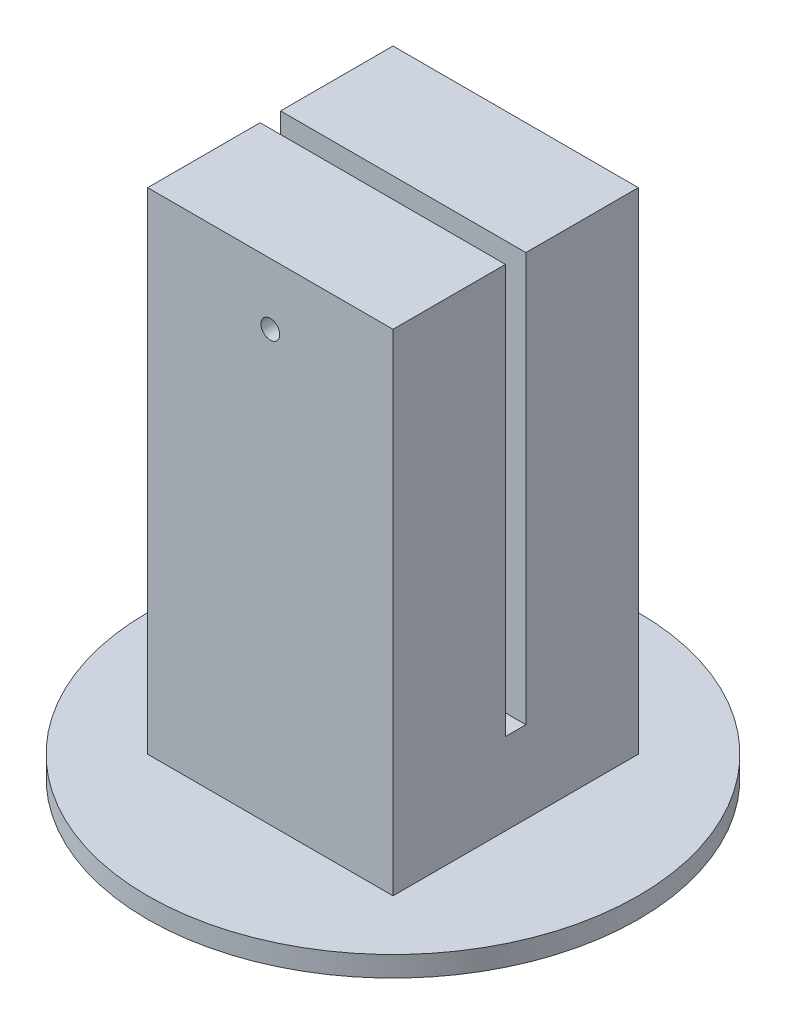
ISO-10303-21;
HEADER;
FILE_DESCRIPTION(('STEP AP214'),'2;1');
FILE_NAME('part.step','',(''),(''),'','','');
FILE_SCHEMA(('AUTOMOTIVE_DESIGN { 1 0 10303 214 1 1 1 1 }'));
ENDSEC;
DATA;
#1=APPLICATION_CONTEXT('core data for automotive mechanical design processes');
#2=APPLICATION_PROTOCOL_DEFINITION('international standard','automotive_design',2000,#1);
#3=PRODUCT_CONTEXT('',#1,'mechanical');
#4=PRODUCT('Part','Part','',(#3));
#5=PRODUCT_RELATED_PRODUCT_CATEGORY('part','',(#4));
#6=PRODUCT_DEFINITION_FORMATION('','',#4);
#7=PRODUCT_DEFINITION_CONTEXT('part definition',#1,'design');
#8=PRODUCT_DEFINITION('design','',#6,#7);
#9=PRODUCT_DEFINITION_SHAPE('','',#8);
#10=(LENGTH_UNIT() NAMED_UNIT(*) SI_UNIT(.MILLI.,.METRE.));
#11=(NAMED_UNIT(*) PLANE_ANGLE_UNIT() SI_UNIT($,.RADIAN.));
#12=(NAMED_UNIT(*) SI_UNIT($,.STERADIAN.) SOLID_ANGLE_UNIT());
#13=UNCERTAINTY_MEASURE_WITH_UNIT(LENGTH_MEASURE(1.E-05),#10,'distance_accuracy_value','');
#14=(GEOMETRIC_REPRESENTATION_CONTEXT(3) GLOBAL_UNCERTAINTY_ASSIGNED_CONTEXT((#13)) GLOBAL_UNIT_ASSIGNED_CONTEXT((#10,
#11,#12)) REPRESENTATION_CONTEXT('',''));
#15=CARTESIAN_POINT('',(0.,0.,0.));
#16=DIRECTION('',(0.,0.,1.));
#17=DIRECTION('',(1.,0.,0.));
#18=AXIS2_PLACEMENT_3D('',#15,#16,#17);
#19=CARTESIAN_POINT('',(0.,79.375,0.));
#20=DIRECTION('',(0.,-1.,0.));
#21=DIRECTION('',(0.,0.,-1.));
#22=AXIS2_PLACEMENT_3D('',#19,#20,#21);
#23=PLANE('',#22);
#24=DIRECTION('',(0.,0.,-1.));
#25=VECTOR('',#24,1.);
#26=CARTESIAN_POINT('',(19.05,79.375,19.05));
#27=LINE('',#26,#25);
#28=CARTESIAN_POINT('',(19.05,79.375,19.05));
#29=VERTEX_POINT('',#28);
#30=CARTESIAN_POINT('',(19.05,79.375,1.5875));
#31=VERTEX_POINT('',#30);
#32=EDGE_CURVE('E217',#29,#31,#27,.T.);
#33=ORIENTED_EDGE('',*,*,#32,.T.);
#34=DIRECTION('',(-1.,0.,0.));
#35=VECTOR('',#34,1.);
#36=CARTESIAN_POINT('',(0.,79.375,1.5875));
#37=LINE('',#36,#35);
#38=CARTESIAN_POINT('',(-19.05,79.375,1.5875));
#39=VERTEX_POINT('',#38);
#40=EDGE_CURVE('E11',#31,#39,#37,.T.);
#41=ORIENTED_EDGE('',*,*,#40,.T.);
#42=DIRECTION('',(0.,0.,1.));
#43=VECTOR('',#42,1.);
#44=CARTESIAN_POINT('',(-19.05,79.375,19.05));
#45=LINE('',#44,#43);
#46=CARTESIAN_POINT('',(-19.05,79.375,19.05));
#47=VERTEX_POINT('',#46);
#48=EDGE_CURVE('E130',#39,#47,#45,.T.);
#49=ORIENTED_EDGE('',*,*,#48,.T.);
#50=DIRECTION('',(1.,0.,0.));
#51=VECTOR('',#50,1.);
#52=CARTESIAN_POINT('',(-19.05,79.375,19.05));
#53=LINE('',#52,#51);
#54=EDGE_CURVE('E129',#47,#29,#53,.T.);
#55=ORIENTED_EDGE('',*,*,#54,.T.);
#56=EDGE_LOOP('',(#33,#41,#49,#55));
#57=FACE_BOUND('',#56,.T.);
#58=ADVANCED_FACE('F40',(#57),#23,.F.);
#59=CARTESIAN_POINT('',(0.,3.175,0.));
#60=DIRECTION('',(0.,-1.,0.));
#61=DIRECTION('',(0.,0.,-1.));
#62=AXIS2_PLACEMENT_3D('',#59,#60,#61);
#63=CYLINDRICAL_SURFACE('',#62,38.1);
#64=CARTESIAN_POINT('',(0.,3.175,0.));
#65=DIRECTION('',(0.,1.,0.));
#66=DIRECTION('',(0.,0.,1.));
#67=AXIS2_PLACEMENT_3D('',#64,#65,#66);
#68=CIRCLE('',#67,38.1);
#69=CARTESIAN_POINT('',(0.,3.175,38.1));
#70=VERTEX_POINT('',#69);
#71=EDGE_CURVE('E112',#70,#70,#68,.T.);
#72=ORIENTED_EDGE('',*,*,#71,.F.);
#73=EDGE_LOOP('',(#72));
#74=FACE_BOUND('',#73,.T.);
#75=CARTESIAN_POINT('',(0.,0.,0.));
#76=DIRECTION('',(0.,1.,0.));
#77=DIRECTION('',(0.,0.,1.));
#78=AXIS2_PLACEMENT_3D('',#75,#76,#77);
#79=CIRCLE('',#78,38.1);
#80=CARTESIAN_POINT('',(0.,0.,38.1));
#81=VERTEX_POINT('',#80);
#82=EDGE_CURVE('E158',#81,#81,#79,.T.);
#83=ORIENTED_EDGE('',*,*,#82,.T.);
#84=EDGE_LOOP('',(#83));
#85=FACE_BOUND('',#84,.T.);
#86=ADVANCED_FACE('F42',(#74,#85),#63,.T.);
#87=CARTESIAN_POINT('',(0.,3.175,0.));
#88=DIRECTION('',(0.,1.,0.));
#89=DIRECTION('',(0.,0.,1.));
#90=AXIS2_PLACEMENT_3D('',#87,#88,#89);
#91=PLANE('',#90);
#92=DIRECTION('',(0.,0.,-1.));
#93=VECTOR('',#92,1.);
#94=CARTESIAN_POINT('',(19.05,3.175,19.05));
#95=LINE('',#94,#93);
#96=CARTESIAN_POINT('',(19.05,3.175,19.05));
#97=VERTEX_POINT('',#96);
#98=CARTESIAN_POINT('',(19.05,3.175,-19.05));
#99=VERTEX_POINT('',#98);
#100=EDGE_CURVE('E64',#97,#99,#95,.T.);
#101=ORIENTED_EDGE('',*,*,#100,.F.);
#102=DIRECTION('',(1.,0.,0.));
#103=VECTOR('',#102,1.);
#104=CARTESIAN_POINT('',(-19.05,3.175,19.05));
#105=LINE('',#104,#103);
#106=CARTESIAN_POINT('',(-19.05,3.175,19.05));
#107=VERTEX_POINT('',#106);
#108=EDGE_CURVE('E145',#107,#97,#105,.T.);
#109=ORIENTED_EDGE('',*,*,#108,.F.);
#110=DIRECTION('',(0.,0.,1.));
#111=VECTOR('',#110,1.);
#112=CARTESIAN_POINT('',(-19.05,3.175,19.05));
#113=LINE('',#112,#111);
#114=CARTESIAN_POINT('',(-19.05,3.175,-19.05));
#115=VERTEX_POINT('',#114);
#116=EDGE_CURVE('E142',#115,#107,#113,.T.);
#117=ORIENTED_EDGE('',*,*,#116,.F.);
#118=DIRECTION('',(-1.,0.,0.));
#119=VECTOR('',#118,1.);
#120=CARTESIAN_POINT('',(-19.05,3.175,-19.05));
#121=LINE('',#120,#119);
#122=EDGE_CURVE('E138',#99,#115,#121,.T.);
#123=ORIENTED_EDGE('',*,*,#122,.F.);
#124=EDGE_LOOP('',(#101,#109,#117,#123));
#125=FACE_BOUND('',#124,.T.);
#126=ORIENTED_EDGE('',*,*,#71,.T.);
#127=EDGE_LOOP('',(#126));
#128=FACE_BOUND('',#127,.T.);
#129=ADVANCED_FACE('F168',(#125,#128),#91,.T.);
#130=CARTESIAN_POINT('',(0.,0.,0.));
#131=DIRECTION('',(0.,1.,0.));
#132=DIRECTION('',(0.,0.,1.));
#133=AXIS2_PLACEMENT_3D('',#130,#131,#132);
#134=PLANE('',#133);
#135=ORIENTED_EDGE('',*,*,#82,.F.);
#136=EDGE_LOOP('',(#135));
#137=FACE_BOUND('',#136,.T.);
#138=ADVANCED_FACE('F165',(#137),#134,.F.);
#139=CARTESIAN_POINT('',(19.05,79.375,19.05));
#140=DIRECTION('',(-1.,0.,0.));
#141=DIRECTION('',(0.,0.,1.));
#142=AXIS2_PLACEMENT_3D('',#139,#140,#141);
#143=PLANE('',#142);
#144=DIRECTION('',(0.,0.,1.));
#145=VECTOR('',#144,1.);
#146=CARTESIAN_POINT('',(19.05,15.875,19.05));
#147=LINE('',#146,#145);
#148=CARTESIAN_POINT('',(19.05,15.875,-1.58749999999999));
#149=VERTEX_POINT('',#148);
#150=CARTESIAN_POINT('',(19.05,15.875,1.5875));
#151=VERTEX_POINT('',#150);
#152=EDGE_CURVE('E139',#149,#151,#147,.T.);
#153=ORIENTED_EDGE('',*,*,#152,.T.);
#154=DIRECTION('',(0.,1.,0.));
#155=VECTOR('',#154,1.);
#156=CARTESIAN_POINT('',(19.05,79.375,1.5875));
#157=LINE('',#156,#155);
#158=EDGE_CURVE('E228',#151,#31,#157,.T.);
#159=ORIENTED_EDGE('',*,*,#158,.T.);
#160=ORIENTED_EDGE('',*,*,#32,.F.);
#161=DIRECTION('',(0.,-1.,0.));
#162=VECTOR('',#161,1.);
#163=CARTESIAN_POINT('',(19.05,79.375,19.05));
#164=LINE('',#163,#162);
#165=EDGE_CURVE('E132',#29,#97,#164,.T.);
#166=ORIENTED_EDGE('',*,*,#165,.T.);
#167=ORIENTED_EDGE('',*,*,#100,.T.);
#168=DIRECTION('',(0.,-1.,0.));
#169=VECTOR('',#168,1.);
#170=CARTESIAN_POINT('',(19.05,79.375,-19.05));
#171=LINE('',#170,#169);
#172=CARTESIAN_POINT('',(19.05,79.375,-19.05));
#173=VERTEX_POINT('',#172);
#174=EDGE_CURVE('E155',#173,#99,#171,.T.);
#175=ORIENTED_EDGE('',*,*,#174,.F.);
#176=CARTESIAN_POINT('',(19.05,79.375,-1.58749999999999));
#177=VERTEX_POINT('',#176);
#178=EDGE_CURVE('E147',#177,#173,#27,.T.);
#179=ORIENTED_EDGE('',*,*,#178,.F.);
#180=DIRECTION('',(0.,-1.,0.));
#181=VECTOR('',#180,1.);
#182=CARTESIAN_POINT('',(19.05,79.375,-1.5875));
#183=LINE('',#182,#181);
#184=EDGE_CURVE('E56',#177,#149,#183,.T.);
#185=ORIENTED_EDGE('',*,*,#184,.T.);
#186=EDGE_LOOP('',(#153,#159,#160,#166,#167,#175,#179,#185));
#187=FACE_BOUND('',#186,.T.);
#188=ADVANCED_FACE('F167',(#187),#143,.F.);
#189=CARTESIAN_POINT('',(-19.05,79.375,-19.05));
#190=DIRECTION('',(0.,0.,1.));
#191=DIRECTION('',(1.,0.,0.));
#192=AXIS2_PLACEMENT_3D('',#189,#190,#191);
#193=PLANE('',#192);
#194=CARTESIAN_POINT('',(0.,69.85,-19.05));
#195=DIRECTION('',(0.,0.,1.));
#196=DIRECTION('',(1.,0.,0.));
#197=AXIS2_PLACEMENT_3D('',#194,#195,#196);
#198=CIRCLE('',#197,1.4605);
#199=CARTESIAN_POINT('',(1.46049999999999,69.85,-19.05));
#200=VERTEX_POINT('',#199);
#201=EDGE_CURVE('E123',#200,#200,#198,.T.);
#202=ORIENTED_EDGE('',*,*,#201,.T.);
#203=EDGE_LOOP('',(#202));
#204=FACE_BOUND('',#203,.T.);
#205=ORIENTED_EDGE('',*,*,#122,.T.);
#206=DIRECTION('',(0.,-1.,0.));
#207=VECTOR('',#206,1.);
#208=CARTESIAN_POINT('',(-19.05,79.375,-19.05));
#209=LINE('',#208,#207);
#210=CARTESIAN_POINT('',(-19.05,79.375,-19.05));
#211=VERTEX_POINT('',#210);
#212=EDGE_CURVE('E153',#211,#115,#209,.T.);
#213=ORIENTED_EDGE('',*,*,#212,.F.);
#214=DIRECTION('',(-1.,0.,0.));
#215=VECTOR('',#214,1.);
#216=CARTESIAN_POINT('',(-19.05,79.375,-19.05));
#217=LINE('',#216,#215);
#218=EDGE_CURVE('E127',#173,#211,#217,.T.);
#219=ORIENTED_EDGE('',*,*,#218,.F.);
#220=ORIENTED_EDGE('',*,*,#174,.T.);
#221=EDGE_LOOP('',(#205,#213,#219,#220));
#222=FACE_BOUND('',#221,.T.);
#223=ADVANCED_FACE('F173',(#204,#222),#193,.F.);
#224=CARTESIAN_POINT('',(-19.05,79.375,19.05));
#225=DIRECTION('',(1.,0.,0.));
#226=DIRECTION('',(0.,0.,-1.));
#227=AXIS2_PLACEMENT_3D('',#224,#225,#226);
#228=PLANE('',#227);
#229=ORIENTED_EDGE('',*,*,#48,.F.);
#230=DIRECTION('',(0.,1.,0.));
#231=VECTOR('',#230,1.);
#232=CARTESIAN_POINT('',(-19.05,15.875,1.5875));
#233=LINE('',#232,#231);
#234=CARTESIAN_POINT('',(-19.05,15.875,1.5875));
#235=VERTEX_POINT('',#234);
#236=EDGE_CURVE('E218',#235,#39,#233,.T.);
#237=ORIENTED_EDGE('',*,*,#236,.F.);
#238=DIRECTION('',(0.,0.,1.));
#239=VECTOR('',#238,1.);
#240=CARTESIAN_POINT('',(-19.05,15.875,-1.58749999999999));
#241=LINE('',#240,#239);
#242=CARTESIAN_POINT('',(-19.05,15.875,-1.58749999999999));
#243=VERTEX_POINT('',#242);
#244=EDGE_CURVE('E122',#243,#235,#241,.T.);
#245=ORIENTED_EDGE('',*,*,#244,.F.);
#246=DIRECTION('',(0.,-1.,0.));
#247=VECTOR('',#246,1.);
#248=CARTESIAN_POINT('',(-19.05,79.375,-1.5875));
#249=LINE('',#248,#247);
#250=CARTESIAN_POINT('',(-19.05,79.375,-1.5875));
#251=VERTEX_POINT('',#250);
#252=EDGE_CURVE('E107',#251,#243,#249,.T.);
#253=ORIENTED_EDGE('',*,*,#252,.F.);
#254=EDGE_CURVE('E119',#211,#251,#45,.T.);
#255=ORIENTED_EDGE('',*,*,#254,.F.);
#256=ORIENTED_EDGE('',*,*,#212,.T.);
#257=ORIENTED_EDGE('',*,*,#116,.T.);
#258=DIRECTION('',(0.,-1.,0.));
#259=VECTOR('',#258,1.);
#260=CARTESIAN_POINT('',(-19.05,79.375,19.05));
#261=LINE('',#260,#259);
#262=EDGE_CURVE('E150',#47,#107,#261,.T.);
#263=ORIENTED_EDGE('',*,*,#262,.F.);
#264=EDGE_LOOP('',(#229,#237,#245,#253,#255,#256,#257,#263));
#265=FACE_BOUND('',#264,.T.);
#266=ADVANCED_FACE('F117',(#265),#228,.F.);
#267=CARTESIAN_POINT('',(-19.05,79.375,19.05));
#268=DIRECTION('',(0.,0.,-1.));
#269=DIRECTION('',(-1.,0.,0.));
#270=AXIS2_PLACEMENT_3D('',#267,#268,#269);
#271=PLANE('',#270);
#272=CARTESIAN_POINT('',(0.,69.85,19.05));
#273=DIRECTION('',(0.,0.,1.));
#274=DIRECTION('',(1.,0.,0.));
#275=AXIS2_PLACEMENT_3D('',#272,#273,#274);
#276=CIRCLE('',#275,1.4605);
#277=CARTESIAN_POINT('',(1.46049999999999,69.85,19.05));
#278=VERTEX_POINT('',#277);
#279=EDGE_CURVE('E257',#278,#278,#276,.T.);
#280=ORIENTED_EDGE('',*,*,#279,.F.);
#281=EDGE_LOOP('',(#280));
#282=FACE_BOUND('',#281,.T.);
#283=ORIENTED_EDGE('',*,*,#108,.T.);
#284=ORIENTED_EDGE('',*,*,#165,.F.);
#285=ORIENTED_EDGE('',*,*,#54,.F.);
#286=ORIENTED_EDGE('',*,*,#262,.T.);
#287=EDGE_LOOP('',(#283,#284,#285,#286));
#288=FACE_BOUND('',#287,.T.);
#289=ADVANCED_FACE('F189',(#282,#288),#271,.F.);
#290=ORIENTED_EDGE('',*,*,#254,.T.);
#291=DIRECTION('',(1.,0.,0.));
#292=VECTOR('',#291,1.);
#293=CARTESIAN_POINT('',(0.,79.375,-1.5875));
#294=LINE('',#293,#292);
#295=EDGE_CURVE('E49',#251,#177,#294,.T.);
#296=ORIENTED_EDGE('',*,*,#295,.T.);
#297=ORIENTED_EDGE('',*,*,#178,.T.);
#298=ORIENTED_EDGE('',*,*,#218,.T.);
#299=EDGE_LOOP('',(#290,#296,#297,#298));
#300=FACE_BOUND('',#299,.T.);
#301=ADVANCED_FACE('F125',(#300),#23,.F.);
#302=CARTESIAN_POINT('',(38.1,15.875,-1.58749999999999));
#303=DIRECTION('',(0.,-1.,0.));
#304=DIRECTION('',(0.,0.,-1.));
#305=AXIS2_PLACEMENT_3D('',#302,#303,#304);
#306=PLANE('',#305);
#307=DIRECTION('',(-1.,0.,0.));
#308=VECTOR('',#307,1.);
#309=CARTESIAN_POINT('',(38.1,15.875,-1.58749999999999));
#310=LINE('',#309,#308);
#311=EDGE_CURVE('E220',#149,#243,#310,.T.);
#312=ORIENTED_EDGE('',*,*,#311,.T.);
#313=ORIENTED_EDGE('',*,*,#244,.T.);
#314=DIRECTION('',(-1.,0.,0.));
#315=VECTOR('',#314,1.);
#316=CARTESIAN_POINT('',(38.1,15.875,1.5875));
#317=LINE('',#316,#315);
#318=EDGE_CURVE('E222',#151,#235,#317,.T.);
#319=ORIENTED_EDGE('',*,*,#318,.F.);
#320=ORIENTED_EDGE('',*,*,#152,.F.);
#321=EDGE_LOOP('',(#312,#313,#319,#320));
#322=FACE_BOUND('',#321,.T.);
#323=ADVANCED_FACE('F188',(#322),#306,.F.);
#324=CARTESIAN_POINT('',(38.1,15.875,1.5875));
#325=DIRECTION('',(0.,0.,1.));
#326=DIRECTION('',(1.,0.,0.));
#327=AXIS2_PLACEMENT_3D('',#324,#325,#326);
#328=PLANE('',#327);
#329=CARTESIAN_POINT('',(0.,69.85,1.58749999999999));
#330=DIRECTION('',(0.,0.,1.));
#331=DIRECTION('',(1.,0.,0.));
#332=AXIS2_PLACEMENT_3D('',#329,#330,#331);
#333=CIRCLE('',#332,1.4605);
#334=CARTESIAN_POINT('',(1.46049999999999,69.85,1.58749999999999));
#335=VERTEX_POINT('',#334);
#336=EDGE_CURVE('E253',#335,#335,#333,.T.);
#337=ORIENTED_EDGE('',*,*,#336,.T.);
#338=EDGE_LOOP('',(#337));
#339=FACE_BOUND('',#338,.T.);
#340=ORIENTED_EDGE('',*,*,#318,.T.);
#341=ORIENTED_EDGE('',*,*,#236,.T.);
#342=ORIENTED_EDGE('',*,*,#40,.F.);
#343=ORIENTED_EDGE('',*,*,#158,.F.);
#344=EDGE_LOOP('',(#340,#341,#342,#343));
#345=FACE_BOUND('',#344,.T.);
#346=ADVANCED_FACE('F194',(#339,#345),#328,.F.);
#347=CARTESIAN_POINT('',(38.1,79.375,-1.5875));
#348=DIRECTION('',(0.,0.,-1.));
#349=DIRECTION('',(0.,1.,0.));
#350=AXIS2_PLACEMENT_3D('',#347,#348,#349);
#351=PLANE('',#350);
#352=CARTESIAN_POINT('',(0.,69.85,-1.58750000000001));
#353=DIRECTION('',(0.,0.,-1.));
#354=DIRECTION('',(0.,1.,0.));
#355=AXIS2_PLACEMENT_3D('',#352,#353,#354);
#356=CIRCLE('',#355,1.4605);
#357=CARTESIAN_POINT('',(1.46049999999999,69.85,-1.58750000000001));
#358=VERTEX_POINT('',#357);
#359=EDGE_CURVE('E44',#358,#358,#356,.T.);
#360=ORIENTED_EDGE('',*,*,#359,.T.);
#361=EDGE_LOOP('',(#360));
#362=FACE_BOUND('',#361,.T.);
#363=ORIENTED_EDGE('',*,*,#295,.F.);
#364=ORIENTED_EDGE('',*,*,#252,.T.);
#365=ORIENTED_EDGE('',*,*,#311,.F.);
#366=ORIENTED_EDGE('',*,*,#184,.F.);
#367=EDGE_LOOP('',(#363,#364,#365,#366));
#368=FACE_BOUND('',#367,.T.);
#369=ADVANCED_FACE('F106',(#362,#368),#351,.F.);
#370=CARTESIAN_POINT('',(0.,69.85,-38.1));
#371=DIRECTION('',(0.,0.,1.));
#372=DIRECTION('',(1.,0.,0.));
#373=AXIS2_PLACEMENT_3D('',#370,#371,#372);
#374=CYLINDRICAL_SURFACE('',#373,1.4605);
#375=CARTESIAN_POINT('',(1.46049999999999,69.85,-1.58750000000001));
#376=CARTESIAN_POINT('',(1.46049999999999,69.85,-1.76940104166667));
#377=CARTESIAN_POINT('',(1.46049999999999,69.85,-1.95130208333334));
#378=CARTESIAN_POINT('',(1.46049999999999,69.85,-2.31510416666667));
#379=CARTESIAN_POINT('',(1.46049999999999,69.85,-2.49700520833334));
#380=CARTESIAN_POINT('',(1.46049999999999,69.85,-2.86080729166667));
#381=CARTESIAN_POINT('',(1.46049999999999,69.85,-3.04270833333334));
#382=CARTESIAN_POINT('',(1.46049999999999,69.85,-3.40651041666667));
#383=CARTESIAN_POINT('',(1.46049999999999,69.85,-3.58841145833334));
#384=CARTESIAN_POINT('',(1.46049999999999,69.85,-3.95221354166667));
#385=CARTESIAN_POINT('',(1.46049999999999,69.85,-4.13411458333334));
#386=CARTESIAN_POINT('',(1.46049999999999,69.85,-4.49791666666667));
#387=CARTESIAN_POINT('',(1.46049999999999,69.85,-4.67981770833334));
#388=CARTESIAN_POINT('',(1.46049999999999,69.85,-5.04361979166667));
#389=CARTESIAN_POINT('',(1.46049999999999,69.85,-5.22552083333334));
#390=CARTESIAN_POINT('',(1.46049999999999,69.85,-5.58932291666667));
#391=CARTESIAN_POINT('',(1.46049999999999,69.85,-5.77122395833334));
#392=CARTESIAN_POINT('',(1.46049999999999,69.85,-6.13502604166667));
#393=CARTESIAN_POINT('',(1.46049999999999,69.85,-6.31692708333334));
#394=CARTESIAN_POINT('',(1.46049999999999,69.85,-6.68072916666667));
#395=CARTESIAN_POINT('',(1.46049999999999,69.85,-6.86263020833334));
#396=CARTESIAN_POINT('',(1.46049999999999,69.85,-7.22643229166667));
#397=CARTESIAN_POINT('',(1.46049999999999,69.85,-7.40833333333333));
#398=CARTESIAN_POINT('',(1.46049999999999,69.85,-7.77213541666667));
#399=CARTESIAN_POINT('',(1.46049999999999,69.85,-7.95403645833334));
#400=CARTESIAN_POINT('',(1.46049999999999,69.85,-8.31783854166667));
#401=CARTESIAN_POINT('',(1.46049999999999,69.85,-8.49973958333333));
#402=CARTESIAN_POINT('',(1.46049999999999,69.85,-8.86354166666667));
#403=CARTESIAN_POINT('',(1.46049999999999,69.85,-9.04544270833333));
#404=CARTESIAN_POINT('',(1.46049999999999,69.85,-9.40924479166667));
#405=CARTESIAN_POINT('',(1.46049999999999,69.85,-9.59114583333333));
#406=CARTESIAN_POINT('',(1.46049999999999,69.85,-9.95494791666667));
#407=CARTESIAN_POINT('',(1.46049999999999,69.85,-10.1368489583333));
#408=CARTESIAN_POINT('',(1.46049999999999,69.85,-10.5006510416667));
#409=CARTESIAN_POINT('',(1.46049999999999,69.85,-10.6825520833333));
#410=CARTESIAN_POINT('',(1.46049999999999,69.85,-11.0463541666667));
#411=CARTESIAN_POINT('',(1.46049999999999,69.85,-11.2282552083333));
#412=CARTESIAN_POINT('',(1.46049999999999,69.85,-11.5920572916667));
#413=CARTESIAN_POINT('',(1.46049999999999,69.85,-11.7739583333333));
#414=CARTESIAN_POINT('',(1.46049999999999,69.85,-12.1377604166667));
#415=CARTESIAN_POINT('',(1.46049999999999,69.85,-12.3196614583333));
#416=CARTESIAN_POINT('',(1.46049999999999,69.85,-12.6834635416667));
#417=CARTESIAN_POINT('',(1.46049999999999,69.85,-12.8653645833333));
#418=CARTESIAN_POINT('',(1.46049999999999,69.85,-13.2291666666667));
#419=CARTESIAN_POINT('',(1.46049999999999,69.85,-13.4110677083333));
#420=CARTESIAN_POINT('',(1.46049999999999,69.85,-13.7748697916667));
#421=CARTESIAN_POINT('',(1.46049999999999,69.85,-13.9567708333333));
#422=CARTESIAN_POINT('',(1.46049999999999,69.85,-14.3205729166667));
#423=CARTESIAN_POINT('',(1.46049999999999,69.85,-14.5024739583333));
#424=CARTESIAN_POINT('',(1.46049999999999,69.85,-14.8662760416667));
#425=CARTESIAN_POINT('',(1.46049999999999,69.85,-15.0481770833333));
#426=CARTESIAN_POINT('',(1.46049999999999,69.85,-15.4119791666667));
#427=CARTESIAN_POINT('',(1.46049999999999,69.85,-15.5938802083333));
#428=CARTESIAN_POINT('',(1.46049999999999,69.85,-15.9576822916667));
#429=CARTESIAN_POINT('',(1.46049999999999,69.85,-16.1395833333333));
#430=CARTESIAN_POINT('',(1.46049999999999,69.85,-16.5033854166667));
#431=CARTESIAN_POINT('',(1.46049999999999,69.85,-16.6852864583333));
#432=CARTESIAN_POINT('',(1.46049999999999,69.85,-17.0490885416667));
#433=CARTESIAN_POINT('',(1.46049999999999,69.85,-17.2309895833333));
#434=CARTESIAN_POINT('',(1.46049999999999,69.85,-17.5947916666667));
#435=CARTESIAN_POINT('',(1.46049999999999,69.85,-17.7766927083333));
#436=CARTESIAN_POINT('',(1.46049999999999,69.85,-18.1404947916667));
#437=CARTESIAN_POINT('',(1.46049999999999,69.85,-18.3223958333333));
#438=CARTESIAN_POINT('',(1.46049999999999,69.85,-18.6861979166667));
#439=CARTESIAN_POINT('',(1.46049999999999,69.85,-18.8680989583333));
#440=CARTESIAN_POINT('',(1.46049999999999,69.85,-19.05));
#441=B_SPLINE_CURVE_WITH_KNOTS('',3,(#375,#376,#377,#378,#379,#380,#381,#382,#383,#384,#385,
#386,#387,#388,#389,#390,#391,#392,#393,#394,#395,#396,#397,#398,#399,#400,#401,#402,#403,#404,
#405,#406,#407,#408,#409,#410,#411,#412,#413,#414,#415,#416,#417,#418,#419,#420,#421,#422,#423,
#424,#425,#426,#427,#428,#429,#430,#431,#432,#433,#434,#435,#436,#437,#438,#439,#440),
.UNSPECIFIED.,.F.,.F.,(4,2,2,2,2,2,2,2,2,2,2,2,2,2,2,2,2,2,2,2,2,2,2,2,2,2,2,2,2,2,2,2,4),(0.,
0.545703124999998,1.09140625,1.637109375,2.1828125,2.728515625,3.27421875,3.819921875,4.365625,
4.911328125,5.45703125,6.002734375,6.5484375,7.094140625,7.63984375,8.18554687499999,8.73125,
9.276953125,9.82265625,10.368359375,10.9140625,11.459765625,12.00546875,12.551171875,13.096875,
13.642578125,14.18828125,14.733984375,15.2796875,15.825390625,16.37109375,16.916796875,17.4625),.UNSPECIFIED.);
#442=EDGE_CURVE('BSEAM239',#358,#200,#441,.T.);
#443=ORIENTED_EDGE('',*,*,#359,.F.);
#444=ORIENTED_EDGE('',*,*,#201,.F.);
#445=ORIENTED_EDGE('',*,*,#442,.T.);
#446=ORIENTED_EDGE('',*,*,#442,.F.);
#447=EDGE_LOOP('',(#443,#445,#444,#446));
#448=FACE_BOUND('',#447,.T.);
#449=ADVANCED_FACE('F239',(#448),#374,.F.);
#450=CARTESIAN_POINT('',(1.46049999999999,69.85,19.05));
#451=CARTESIAN_POINT('',(1.46049999999999,69.85,18.8680989583333));
#452=CARTESIAN_POINT('',(1.46049999999999,69.85,18.6861979166667));
#453=CARTESIAN_POINT('',(1.46049999999999,69.85,18.3223958333333));
#454=CARTESIAN_POINT('',(1.46049999999999,69.85,18.1404947916667));
#455=CARTESIAN_POINT('',(1.46049999999999,69.85,17.7766927083333));
#456=CARTESIAN_POINT('',(1.46049999999999,69.85,17.5947916666667));
#457=CARTESIAN_POINT('',(1.46049999999999,69.85,17.2309895833333));
#458=CARTESIAN_POINT('',(1.46049999999999,69.85,17.0490885416667));
#459=CARTESIAN_POINT('',(1.46049999999999,69.85,16.6852864583333));
#460=CARTESIAN_POINT('',(1.46049999999999,69.85,16.5033854166667));
#461=CARTESIAN_POINT('',(1.46049999999999,69.85,16.1395833333333));
#462=CARTESIAN_POINT('',(1.46049999999999,69.85,15.9576822916667));
#463=CARTESIAN_POINT('',(1.46049999999999,69.85,15.5938802083333));
#464=CARTESIAN_POINT('',(1.46049999999999,69.85,15.4119791666667));
#465=CARTESIAN_POINT('',(1.46049999999999,69.85,15.0481770833333));
#466=CARTESIAN_POINT('',(1.46049999999999,69.85,14.8662760416667));
#467=CARTESIAN_POINT('',(1.46049999999999,69.85,14.5024739583333));
#468=CARTESIAN_POINT('',(1.46049999999999,69.85,14.3205729166667));
#469=CARTESIAN_POINT('',(1.46049999999999,69.85,13.9567708333333));
#470=CARTESIAN_POINT('',(1.46049999999999,69.85,13.7748697916667));
#471=CARTESIAN_POINT('',(1.46049999999999,69.85,13.4110677083333));
#472=CARTESIAN_POINT('',(1.46049999999999,69.85,13.2291666666667));
#473=CARTESIAN_POINT('',(1.46049999999999,69.85,12.8653645833333));
#474=CARTESIAN_POINT('',(1.46049999999999,69.85,12.6834635416667));
#475=CARTESIAN_POINT('',(1.46049999999999,69.85,12.3196614583333));
#476=CARTESIAN_POINT('',(1.46049999999999,69.85,12.1377604166667));
#477=CARTESIAN_POINT('',(1.46049999999999,69.85,11.7739583333333));
#478=CARTESIAN_POINT('',(1.46049999999999,69.85,11.5920572916667));
#479=CARTESIAN_POINT('',(1.46049999999999,69.85,11.2282552083333));
#480=CARTESIAN_POINT('',(1.46049999999999,69.85,11.0463541666667));
#481=CARTESIAN_POINT('',(1.46049999999999,69.85,10.6825520833333));
#482=CARTESIAN_POINT('',(1.46049999999999,69.85,10.5006510416667));
#483=CARTESIAN_POINT('',(1.46049999999999,69.85,10.1368489583333));
#484=CARTESIAN_POINT('',(1.46049999999999,69.85,9.95494791666666));
#485=CARTESIAN_POINT('',(1.46049999999999,69.85,9.59114583333333));
#486=CARTESIAN_POINT('',(1.46049999999999,69.85,9.40924479166666));
#487=CARTESIAN_POINT('',(1.46049999999999,69.85,9.04544270833333));
#488=CARTESIAN_POINT('',(1.46049999999999,69.85,8.86354166666666));
#489=CARTESIAN_POINT('',(1.46049999999999,69.85,8.49973958333333));
#490=CARTESIAN_POINT('',(1.46049999999999,69.85,8.31783854166666));
#491=CARTESIAN_POINT('',(1.46049999999999,69.85,7.95403645833333));
#492=CARTESIAN_POINT('',(1.46049999999999,69.85,7.77213541666666));
#493=CARTESIAN_POINT('',(1.46049999999999,69.85,7.40833333333333));
#494=CARTESIAN_POINT('',(1.46049999999999,69.85,7.22643229166666));
#495=CARTESIAN_POINT('',(1.46049999999999,69.85,6.86263020833333));
#496=CARTESIAN_POINT('',(1.46049999999999,69.85,6.68072916666666));
#497=CARTESIAN_POINT('',(1.46049999999999,69.85,6.31692708333333));
#498=CARTESIAN_POINT('',(1.46049999999999,69.85,6.13502604166666));
#499=CARTESIAN_POINT('',(1.46049999999999,69.85,5.77122395833332));
#500=CARTESIAN_POINT('',(1.46049999999999,69.85,5.58932291666666));
#501=CARTESIAN_POINT('',(1.46049999999999,69.85,5.22552083333333));
#502=CARTESIAN_POINT('',(1.46049999999999,69.85,5.04361979166666));
#503=CARTESIAN_POINT('',(1.46049999999999,69.85,4.67981770833333));
#504=CARTESIAN_POINT('',(1.46049999999999,69.85,4.49791666666666));
#505=CARTESIAN_POINT('',(1.46049999999999,69.85,4.13411458333332));
#506=CARTESIAN_POINT('',(1.46049999999999,69.85,3.95221354166666));
#507=CARTESIAN_POINT('',(1.46049999999999,69.85,3.58841145833332));
#508=CARTESIAN_POINT('',(1.46049999999999,69.85,3.40651041666666));
#509=CARTESIAN_POINT('',(1.46049999999999,69.85,3.04270833333332));
#510=CARTESIAN_POINT('',(1.46049999999999,69.85,2.86080729166666));
#511=CARTESIAN_POINT('',(1.46049999999999,69.85,2.49700520833332));
#512=CARTESIAN_POINT('',(1.46049999999999,69.85,2.31510416666666));
#513=CARTESIAN_POINT('',(1.46049999999999,69.85,1.95130208333333));
#514=CARTESIAN_POINT('',(1.46049999999999,69.85,1.76940104166666));
#515=CARTESIAN_POINT('',(1.46049999999999,69.85,1.58749999999999));
#516=B_SPLINE_CURVE_WITH_KNOTS('',3,(#450,#451,#452,#453,#454,#455,#456,#457,#458,#459,#460,
#461,#462,#463,#464,#465,#466,#467,#468,#469,#470,#471,#472,#473,#474,#475,#476,#477,#478,#479,
#480,#481,#482,#483,#484,#485,#486,#487,#488,#489,#490,#491,#492,#493,#494,#495,#496,#497,#498,
#499,#500,#501,#502,#503,#504,#505,#506,#507,#508,#509,#510,#511,#512,#513,#514,#515),
.UNSPECIFIED.,.F.,.F.,(4,2,2,2,2,2,2,2,2,2,2,2,2,2,2,2,2,2,2,2,2,2,2,2,2,2,2,2,2,2,2,2,4),(0.,
0.545703124999998,1.09140625,1.637109375,2.1828125,2.728515625,3.27421875,3.819921875,4.365625,
4.911328125,5.45703125,6.002734375,6.5484375,7.094140625,7.63984375,8.18554687500001,8.73125,
9.276953125,9.82265625,10.368359375,10.9140625,11.459765625,12.00546875,12.551171875,13.096875,
13.642578125,14.18828125,14.733984375,15.2796875,15.825390625,16.37109375,16.916796875,17.4625),.UNSPECIFIED.);
#517=EDGE_CURVE('BSEAM244',#278,#335,#516,.T.);
#518=ORIENTED_EDGE('',*,*,#279,.T.);
#519=ORIENTED_EDGE('',*,*,#336,.F.);
#520=ORIENTED_EDGE('',*,*,#517,.T.);
#521=ORIENTED_EDGE('',*,*,#517,.F.);
#522=EDGE_LOOP('',(#518,#520,#519,#521));
#523=FACE_BOUND('',#522,.T.);
#524=ADVANCED_FACE('F244',(#523),#374,.F.);
#525=CLOSED_SHELL('',(#58,#86,#129,#138,#188,#223,#266,#289,#301,#323,#346,#369,#449,#524));
#526=MANIFOLD_SOLID_BREP('B2',#525);
#527=ADVANCED_BREP_SHAPE_REPRESENTATION('',(#18,#526),#14);
#528=SHAPE_DEFINITION_REPRESENTATION(#9,#527);
ENDSEC;
END-ISO-10303-21;
